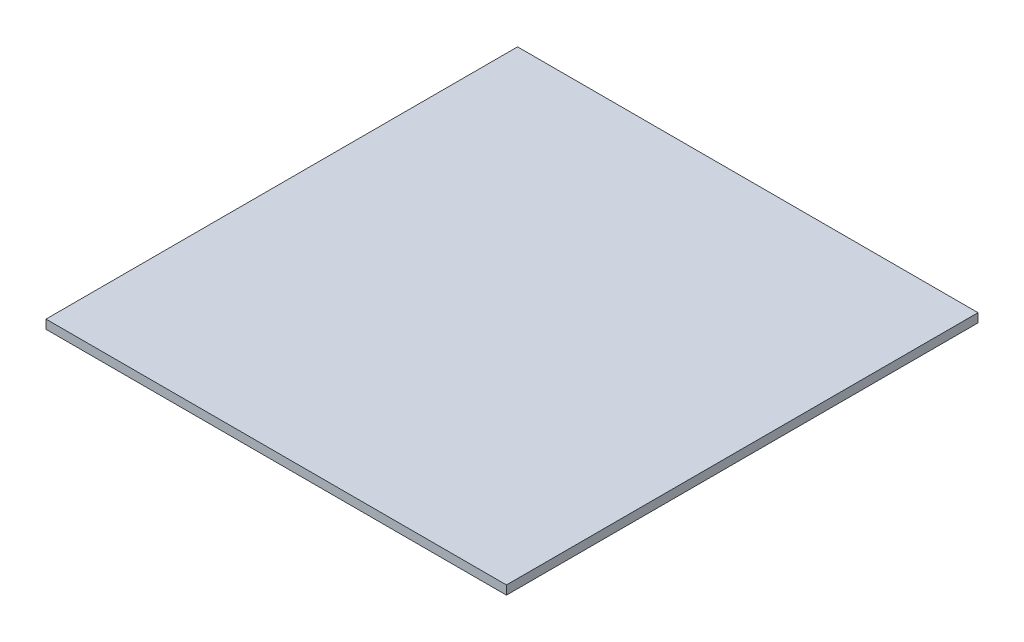
ISO-10303-21;
HEADER;
FILE_DESCRIPTION(('STEP AP214'),'2;1');
FILE_NAME('part.step','',(''),(''),'','','');
FILE_SCHEMA(('AUTOMOTIVE_DESIGN { 1 0 10303 214 1 1 1 1 }'));
ENDSEC;
DATA;
#1=APPLICATION_CONTEXT('core data for automotive mechanical design processes');
#2=APPLICATION_PROTOCOL_DEFINITION('international standard','automotive_design',2000,#1);
#3=PRODUCT_CONTEXT('',#1,'mechanical');
#4=PRODUCT('Part','Part','',(#3));
#5=PRODUCT_RELATED_PRODUCT_CATEGORY('part','',(#4));
#6=PRODUCT_DEFINITION_FORMATION('','',#4);
#7=PRODUCT_DEFINITION_CONTEXT('part definition',#1,'design');
#8=PRODUCT_DEFINITION('design','',#6,#7);
#9=PRODUCT_DEFINITION_SHAPE('','',#8);
#10=(LENGTH_UNIT() NAMED_UNIT(*) SI_UNIT(.MILLI.,.METRE.));
#11=(NAMED_UNIT(*) PLANE_ANGLE_UNIT() SI_UNIT($,.RADIAN.));
#12=(NAMED_UNIT(*) SI_UNIT($,.STERADIAN.) SOLID_ANGLE_UNIT());
#13=UNCERTAINTY_MEASURE_WITH_UNIT(LENGTH_MEASURE(1.E-05),#10,'distance_accuracy_value','');
#14=(GEOMETRIC_REPRESENTATION_CONTEXT(3) GLOBAL_UNCERTAINTY_ASSIGNED_CONTEXT((#13)) GLOBAL_UNIT_ASSIGNED_CONTEXT((#10,
#11,#12)) REPRESENTATION_CONTEXT('',''));
#15=CARTESIAN_POINT('',(0.,0.,0.));
#16=DIRECTION('',(0.,0.,1.));
#17=DIRECTION('',(1.,0.,0.));
#18=AXIS2_PLACEMENT_3D('',#15,#16,#17);
#19=CARTESIAN_POINT('',(41.5,1.6,42.5));
#20=DIRECTION('',(-1.,0.,0.));
#21=DIRECTION('',(0.,0.,1.));
#22=AXIS2_PLACEMENT_3D('',#19,#20,#21);
#23=PLANE('',#22);
#24=DIRECTION('',(0.,0.,-1.));
#25=VECTOR('',#24,1.);
#26=CARTESIAN_POINT('',(41.5,0.,42.5));
#27=LINE('',#26,#25);
#28=CARTESIAN_POINT('',(41.5,0.,42.5));
#29=VERTEX_POINT('',#28);
#30=CARTESIAN_POINT('',(41.5,0.,-42.5));
#31=VERTEX_POINT('',#30);
#32=EDGE_CURVE('E100',#29,#31,#27,.T.);
#33=ORIENTED_EDGE('',*,*,#32,.T.);
#34=DIRECTION('',(0.,-1.,0.));
#35=VECTOR('',#34,1.);
#36=CARTESIAN_POINT('',(41.5,1.6,-42.5));
#37=LINE('',#36,#35);
#38=CARTESIAN_POINT('',(41.5,1.6,-42.5));
#39=VERTEX_POINT('',#38);
#40=EDGE_CURVE('E11',#39,#31,#37,.T.);
#41=ORIENTED_EDGE('',*,*,#40,.F.);
#42=DIRECTION('',(0.,0.,-1.));
#43=VECTOR('',#42,1.);
#44=CARTESIAN_POINT('',(41.5,1.6,42.5));
#45=LINE('',#44,#43);
#46=CARTESIAN_POINT('',(41.5,1.6,42.5));
#47=VERTEX_POINT('',#46);
#48=EDGE_CURVE('E88',#47,#39,#45,.T.);
#49=ORIENTED_EDGE('',*,*,#48,.F.);
#50=DIRECTION('',(0.,-1.,0.));
#51=VECTOR('',#50,1.);
#52=CARTESIAN_POINT('',(41.5,1.6,42.5));
#53=LINE('',#52,#51);
#54=EDGE_CURVE('E96',#47,#29,#53,.T.);
#55=ORIENTED_EDGE('',*,*,#54,.T.);
#56=EDGE_LOOP('',(#33,#41,#49,#55));
#57=FACE_BOUND('',#56,.T.);
#58=ADVANCED_FACE('F37',(#57),#23,.F.);
#59=CARTESIAN_POINT('',(-41.5,1.6,-42.5));
#60=DIRECTION('',(0.,0.,1.));
#61=DIRECTION('',(1.,0.,0.));
#62=AXIS2_PLACEMENT_3D('',#59,#60,#61);
#63=PLANE('',#62);
#64=DIRECTION('',(-1.,0.,0.));
#65=VECTOR('',#64,1.);
#66=CARTESIAN_POINT('',(-41.5,0.,-42.5));
#67=LINE('',#66,#65);
#68=CARTESIAN_POINT('',(-41.5,0.,-42.5));
#69=VERTEX_POINT('',#68);
#70=EDGE_CURVE('E92',#31,#69,#67,.T.);
#71=ORIENTED_EDGE('',*,*,#70,.T.);
#72=DIRECTION('',(0.,-1.,0.));
#73=VECTOR('',#72,1.);
#74=CARTESIAN_POINT('',(-41.5,1.6,-42.5));
#75=LINE('',#74,#73);
#76=CARTESIAN_POINT('',(-41.5,1.6,-42.5));
#77=VERTEX_POINT('',#76);
#78=EDGE_CURVE('E45',#77,#69,#75,.T.);
#79=ORIENTED_EDGE('',*,*,#78,.F.);
#80=DIRECTION('',(-1.,0.,0.));
#81=VECTOR('',#80,1.);
#82=CARTESIAN_POINT('',(-41.5,1.6,-42.5));
#83=LINE('',#82,#81);
#84=EDGE_CURVE('E83',#39,#77,#83,.T.);
#85=ORIENTED_EDGE('',*,*,#84,.F.);
#86=ORIENTED_EDGE('',*,*,#40,.T.);
#87=EDGE_LOOP('',(#71,#79,#85,#86));
#88=FACE_BOUND('',#87,.T.);
#89=ADVANCED_FACE('F91',(#88),#63,.F.);
#90=CARTESIAN_POINT('',(-41.5,1.6,42.5));
#91=DIRECTION('',(1.,0.,0.));
#92=DIRECTION('',(0.,0.,-1.));
#93=AXIS2_PLACEMENT_3D('',#90,#91,#92);
#94=PLANE('',#93);
#95=DIRECTION('',(0.,0.,1.));
#96=VECTOR('',#95,1.);
#97=CARTESIAN_POINT('',(-41.5,0.,42.5));
#98=LINE('',#97,#96);
#99=CARTESIAN_POINT('',(-41.5,0.,42.5));
#100=VERTEX_POINT('',#99);
#101=EDGE_CURVE('E70',#69,#100,#98,.T.);
#102=ORIENTED_EDGE('',*,*,#101,.T.);
#103=DIRECTION('',(0.,-1.,0.));
#104=VECTOR('',#103,1.);
#105=CARTESIAN_POINT('',(-41.5,1.6,42.5));
#106=LINE('',#105,#104);
#107=CARTESIAN_POINT('',(-41.5,1.6,42.5));
#108=VERTEX_POINT('',#107);
#109=EDGE_CURVE('E93',#108,#100,#106,.T.);
#110=ORIENTED_EDGE('',*,*,#109,.F.);
#111=DIRECTION('',(0.,0.,1.));
#112=VECTOR('',#111,1.);
#113=CARTESIAN_POINT('',(-41.5,1.6,42.5));
#114=LINE('',#113,#112);
#115=EDGE_CURVE('E86',#77,#108,#114,.T.);
#116=ORIENTED_EDGE('',*,*,#115,.F.);
#117=ORIENTED_EDGE('',*,*,#78,.T.);
#118=EDGE_LOOP('',(#102,#110,#116,#117));
#119=FACE_BOUND('',#118,.T.);
#120=ADVANCED_FACE('F94',(#119),#94,.F.);
#121=CARTESIAN_POINT('',(-41.5,1.6,42.5));
#122=DIRECTION('',(0.,0.,-1.));
#123=DIRECTION('',(-1.,0.,0.));
#124=AXIS2_PLACEMENT_3D('',#121,#122,#123);
#125=PLANE('',#124);
#126=DIRECTION('',(1.,0.,0.));
#127=VECTOR('',#126,1.);
#128=CARTESIAN_POINT('',(-41.5,0.,42.5));
#129=LINE('',#128,#127);
#130=EDGE_CURVE('E76',#100,#29,#129,.T.);
#131=ORIENTED_EDGE('',*,*,#130,.T.);
#132=ORIENTED_EDGE('',*,*,#54,.F.);
#133=DIRECTION('',(1.,0.,0.));
#134=VECTOR('',#133,1.);
#135=CARTESIAN_POINT('',(-41.5,1.6,42.5));
#136=LINE('',#135,#134);
#137=EDGE_CURVE('E53',#108,#47,#136,.T.);
#138=ORIENTED_EDGE('',*,*,#137,.F.);
#139=ORIENTED_EDGE('',*,*,#109,.T.);
#140=EDGE_LOOP('',(#131,#132,#138,#139));
#141=FACE_BOUND('',#140,.T.);
#142=ADVANCED_FACE('F107',(#141),#125,.F.);
#143=CARTESIAN_POINT('',(0.,1.6,0.));
#144=DIRECTION('',(0.,-1.,0.));
#145=DIRECTION('',(0.,0.,-1.));
#146=AXIS2_PLACEMENT_3D('',#143,#144,#145);
#147=PLANE('',#146);
#148=ORIENTED_EDGE('',*,*,#48,.T.);
#149=ORIENTED_EDGE('',*,*,#84,.T.);
#150=ORIENTED_EDGE('',*,*,#115,.T.);
#151=ORIENTED_EDGE('',*,*,#137,.T.);
#152=EDGE_LOOP('',(#148,#149,#150,#151));
#153=FACE_BOUND('',#152,.T.);
#154=ADVANCED_FACE('F84',(#153),#147,.F.);
#155=CARTESIAN_POINT('',(0.,0.,0.));
#156=DIRECTION('',(0.,-1.,0.));
#157=DIRECTION('',(0.,0.,-1.));
#158=AXIS2_PLACEMENT_3D('',#155,#156,#157);
#159=PLANE('',#158);
#160=ORIENTED_EDGE('',*,*,#32,.F.);
#161=ORIENTED_EDGE('',*,*,#130,.F.);
#162=ORIENTED_EDGE('',*,*,#101,.F.);
#163=ORIENTED_EDGE('',*,*,#70,.F.);
#164=EDGE_LOOP('',(#160,#161,#162,#163));
#165=FACE_BOUND('',#164,.T.);
#166=ADVANCED_FACE('F110',(#165),#159,.T.);
#167=CLOSED_SHELL('',(#58,#89,#120,#142,#154,#166));
#168=MANIFOLD_SOLID_BREP('B2',#167);
#169=ADVANCED_BREP_SHAPE_REPRESENTATION('',(#18,#168),#14);
#170=SHAPE_DEFINITION_REPRESENTATION(#9,#169);
ENDSEC;
END-ISO-10303-21;
